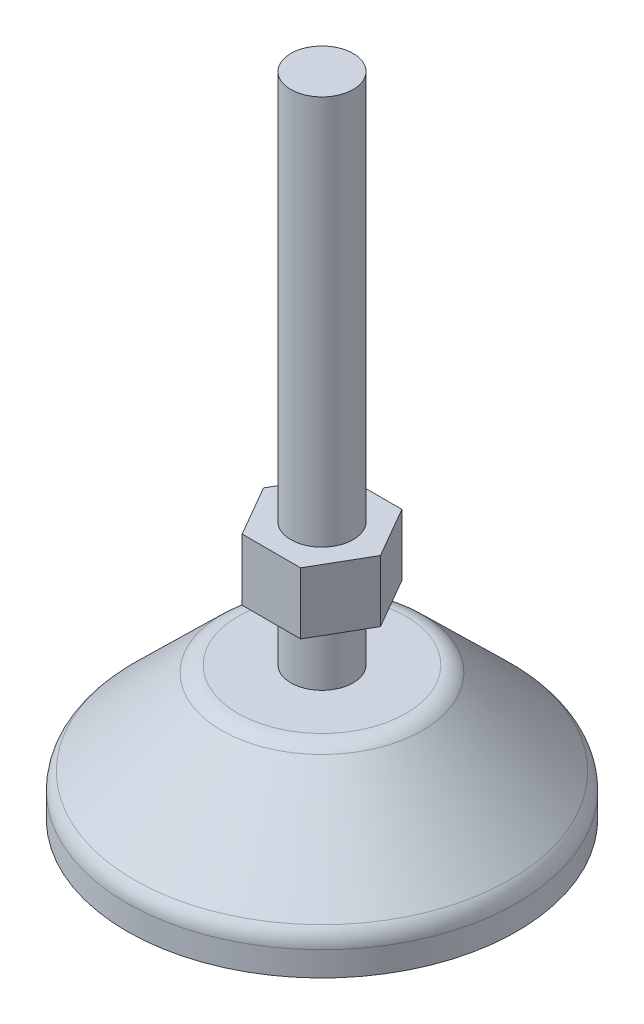
ISO-10303-21;
HEADER;
FILE_DESCRIPTION(('STEP AP214'),'2;1');
FILE_NAME('part.step','',(''),(''),'','','');
FILE_SCHEMA(('AUTOMOTIVE_DESIGN { 1 0 10303 214 1 1 1 1 }'));
ENDSEC;
DATA;
#1=APPLICATION_CONTEXT('core data for automotive mechanical design processes');
#2=APPLICATION_PROTOCOL_DEFINITION('international standard','automotive_design',2000,#1);
#3=PRODUCT_CONTEXT('',#1,'mechanical');
#4=PRODUCT('Part','Part','',(#3));
#5=PRODUCT_RELATED_PRODUCT_CATEGORY('part','',(#4));
#6=PRODUCT_DEFINITION_FORMATION('','',#4);
#7=PRODUCT_DEFINITION_CONTEXT('part definition',#1,'design');
#8=PRODUCT_DEFINITION('design','',#6,#7);
#9=PRODUCT_DEFINITION_SHAPE('','',#8);
#10=(LENGTH_UNIT() NAMED_UNIT(*) SI_UNIT(.MILLI.,.METRE.));
#11=(NAMED_UNIT(*) PLANE_ANGLE_UNIT() SI_UNIT($,.RADIAN.));
#12=(NAMED_UNIT(*) SI_UNIT($,.STERADIAN.) SOLID_ANGLE_UNIT());
#13=UNCERTAINTY_MEASURE_WITH_UNIT(LENGTH_MEASURE(1.E-05),#10,'distance_accuracy_value','');
#14=(GEOMETRIC_REPRESENTATION_CONTEXT(3) GLOBAL_UNCERTAINTY_ASSIGNED_CONTEXT((#13)) GLOBAL_UNIT_ASSIGNED_CONTEXT((#10,
#11,#12)) REPRESENTATION_CONTEXT('',''));
#15=CARTESIAN_POINT('',(0.,0.,0.));
#16=DIRECTION('',(0.,0.,1.));
#17=DIRECTION('',(1.,0.,0.));
#18=AXIS2_PLACEMENT_3D('',#15,#16,#17);
#19=CARTESIAN_POINT('',(4.,25.1,0.));
#20=DIRECTION('',(0.,1.,0.));
#21=DIRECTION('',(0.,0.,1.));
#22=AXIS2_PLACEMENT_3D('',#19,#20,#21);
#23=PLANE('',#22);
#24=CARTESIAN_POINT('',(0.,25.1,0.));
#25=DIRECTION('',(0.,1.,0.));
#26=DIRECTION('',(0.,0.,1.));
#27=AXIS2_PLACEMENT_3D('',#24,#25,#26);
#28=CIRCLE('',#27,4.);
#29=CARTESIAN_POINT('',(0.,25.1,4.));
#30=VERTEX_POINT('',#29);
#31=EDGE_CURVE('E143',#30,#30,#28,.T.);
#32=ORIENTED_EDGE('',*,*,#31,.T.);
#33=EDGE_LOOP('',(#32));
#34=FACE_BOUND('',#33,.T.);
#35=DIRECTION('',(0.499999999999995,0.,-0.866025403784442));
#36=VECTOR('',#35,1.);
#37=CARTESIAN_POINT('',(6.62500000000002,25.1,1.51554445662276));
#38=LINE('',#37,#36);
#39=CARTESIAN_POINT('',(3.75000000000008,25.1,6.49519052838325));
#40=VERTEX_POINT('',#39);
#41=CARTESIAN_POINT('',(7.5,25.1,0.));
#42=VERTEX_POINT('',#41);
#43=EDGE_CURVE('E135',#40,#42,#38,.T.);
#44=ORIENTED_EDGE('',*,*,#43,.F.);
#45=DIRECTION('',(1.,0.,0.));
#46=VECTOR('',#45,1.);
#47=CARTESIAN_POINT('',(4.00000000000007,25.1,6.49519052838324));
#48=LINE('',#47,#46);
#49=CARTESIAN_POINT('',(-3.74999999999994,25.1,6.49519052838332));
#50=VERTEX_POINT('',#49);
#51=EDGE_CURVE('E133',#50,#40,#48,.T.);
#52=ORIENTED_EDGE('',*,*,#51,.F.);
#53=DIRECTION('',(0.500000000000007,0.,0.866025403784435));
#54=VECTOR('',#53,1.);
#55=CARTESIAN_POINT('',(-4.62499999999994,25.1,4.97964607176058));
#56=LINE('',#55,#54);
#57=CARTESIAN_POINT('',(-7.5,25.1,0.));
#58=VERTEX_POINT('',#57);
#59=EDGE_CURVE('E131',#58,#50,#56,.T.);
#60=ORIENTED_EDGE('',*,*,#59,.F.);
#61=DIRECTION('',(-0.499999999999995,0.,0.866025403784442));
#62=VECTOR('',#61,1.);
#63=CARTESIAN_POINT('',(-4.62500000000003,25.1,-4.97964607176047));
#64=LINE('',#63,#62);
#65=CARTESIAN_POINT('',(-3.75000000000003,25.1,-6.49519052838327));
#66=VERTEX_POINT('',#65);
#67=EDGE_CURVE('E129',#66,#58,#64,.T.);
#68=ORIENTED_EDGE('',*,*,#67,.F.);
#69=DIRECTION('',(-1.,0.,0.));
#70=VECTOR('',#69,1.);
#71=CARTESIAN_POINT('',(3.99999999999998,25.1,-6.4951905283833));
#72=LINE('',#71,#70);
#73=CARTESIAN_POINT('',(3.74999999999998,25.1,-6.4951905283833));
#74=VERTEX_POINT('',#73);
#75=EDGE_CURVE('E91',#74,#66,#72,.T.);
#76=ORIENTED_EDGE('',*,*,#75,.F.);
#77=DIRECTION('',(-0.500000000000001,0.,-0.866025403784438));
#78=VECTOR('',#77,1.);
#79=CARTESIAN_POINT('',(6.625,25.1,-1.51554445662277));
#80=LINE('',#79,#78);
#81=EDGE_CURVE('E121',#42,#74,#80,.T.);
#82=ORIENTED_EDGE('',*,*,#81,.F.);
#83=EDGE_LOOP('',(#44,#52,#60,#68,#76,#82));
#84=FACE_BOUND('',#83,.T.);
#85=ADVANCED_FACE('F35',(#34,#84),#23,.F.);
#86=CARTESIAN_POINT('',(0.,0.,0.));
#87=DIRECTION('',(0.,1.,0.));
#88=DIRECTION('',(0.,0.,1.));
#89=AXIS2_PLACEMENT_3D('',#86,#87,#88);
#90=PLANE('',#89);
#91=CARTESIAN_POINT('',(0.,0.,0.));
#92=DIRECTION('',(0.,1.,0.));
#93=DIRECTION('',(0.,0.,1.));
#94=AXIS2_PLACEMENT_3D('',#91,#92,#93);
#95=CIRCLE('',#94,25.);
#96=CARTESIAN_POINT('',(0.,0.,25.));
#97=VERTEX_POINT('',#96);
#98=EDGE_CURVE('E11',#97,#97,#95,.T.);
#99=ORIENTED_EDGE('',*,*,#98,.F.);
#100=EDGE_LOOP('',(#99));
#101=FACE_BOUND('',#100,.T.);
#102=ADVANCED_FACE('F37',(#101),#90,.F.);
#103=CARTESIAN_POINT('',(0.,83.,0.));
#104=DIRECTION('',(0.,1.,0.));
#105=DIRECTION('',(0.,0.,1.));
#106=AXIS2_PLACEMENT_3D('',#103,#104,#105);
#107=CYLINDRICAL_SURFACE('',#106,25.);
#108=CARTESIAN_POINT('',(0.,3.13468674441344,0.));
#109=DIRECTION('',(0.,1.,0.));
#110=DIRECTION('',(0.,0.,1.));
#111=AXIS2_PLACEMENT_3D('',#108,#109,#110);
#112=CIRCLE('',#111,25.);
#113=CARTESIAN_POINT('',(0.,3.13468674441344,25.));
#114=VERTEX_POINT('',#113);
#115=EDGE_CURVE('E43',#114,#114,#112,.T.);
#116=ORIENTED_EDGE('',*,*,#115,.F.);
#117=EDGE_LOOP('',(#116));
#118=FACE_BOUND('',#117,.T.);
#119=ORIENTED_EDGE('',*,*,#98,.T.);
#120=EDGE_LOOP('',(#119));
#121=FACE_BOUND('',#120,.T.);
#122=ADVANCED_FACE('F162',(#118,#121),#107,.T.);
#123=CARTESIAN_POINT('',(0.,3.13468674441344,0.));
#124=DIRECTION('',(0.,1.,0.));
#125=DIRECTION('',(0.,0.,1.));
#126=AXIS2_PLACEMENT_3D('',#123,#124,#125);
#127=TOROIDAL_SURFACE('',#126,22.,3.);
#128=CARTESIAN_POINT('',(0.,5.28043631475277,0.));
#129=DIRECTION('',(0.,1.,0.));
#130=DIRECTION('',(0.,0.,1.));
#131=AXIS2_PLACEMENT_3D('',#128,#129,#130);
#132=CIRCLE('',#131,24.0966064917835);
#133=CARTESIAN_POINT('',(0.,5.28043631475277,24.0966064917835));
#134=VERTEX_POINT('',#133);
#135=EDGE_CURVE('E155',#134,#134,#132,.T.);
#136=ORIENTED_EDGE('',*,*,#135,.F.);
#137=EDGE_LOOP('',(#136));
#138=FACE_BOUND('',#137,.T.);
#139=ORIENTED_EDGE('',*,*,#115,.T.);
#140=EDGE_LOOP('',(#139));
#141=FACE_BOUND('',#140,.T.);
#142=ADVANCED_FACE('F160',(#138,#141),#127,.T.);
#143=CARTESIAN_POINT('',(0.,5.28043631475277,0.));
#144=DIRECTION('',(0.,-1.,0.));
#145=DIRECTION('',(0.,0.,-1.));
#146=AXIS2_PLACEMENT_3D('',#143,#144,#145);
#147=CONICAL_SURFACE('',#146,24.0966064917835,0.796981557127882);
#148=CARTESIAN_POINT('',(0.,16.2457495703396,0.));
#149=DIRECTION('',(0.,1.,0.));
#150=DIRECTION('',(0.,0.,1.));
#151=AXIS2_PLACEMENT_3D('',#148,#149,#150);
#152=CIRCLE('',#151,12.8742734984321);
#153=CARTESIAN_POINT('',(0.,16.2457495703396,12.8742734984321));
#154=VERTEX_POINT('',#153);
#155=EDGE_CURVE('E152',#154,#154,#152,.T.);
#156=ORIENTED_EDGE('',*,*,#155,.F.);
#157=EDGE_LOOP('',(#156));
#158=FACE_BOUND('',#157,.T.);
#159=ORIENTED_EDGE('',*,*,#135,.T.);
#160=EDGE_LOOP('',(#159));
#161=FACE_BOUND('',#160,.T.);
#162=ADVANCED_FACE('F191',(#158,#161),#147,.T.);
#163=CARTESIAN_POINT('',(0.,14.1,0.));
#164=DIRECTION('',(0.,1.,0.));
#165=DIRECTION('',(0.,0.,1.));
#166=AXIS2_PLACEMENT_3D('',#163,#164,#165);
#167=TOROIDAL_SURFACE('',#166,10.7776670066487,3.00000000000008);
#168=CARTESIAN_POINT('',(0.,17.1000000000001,0.));
#169=DIRECTION('',(0.,1.,0.));
#170=DIRECTION('',(0.,0.,1.));
#171=AXIS2_PLACEMENT_3D('',#168,#169,#170);
#172=CIRCLE('',#171,10.7776670066487);
#173=CARTESIAN_POINT('',(0.,17.1000000000001,10.7776670066487));
#174=VERTEX_POINT('',#173);
#175=EDGE_CURVE('E149',#174,#174,#172,.T.);
#176=ORIENTED_EDGE('',*,*,#175,.F.);
#177=EDGE_LOOP('',(#176));
#178=FACE_BOUND('',#177,.T.);
#179=ORIENTED_EDGE('',*,*,#155,.T.);
#180=EDGE_LOOP('',(#179));
#181=FACE_BOUND('',#180,.T.);
#182=ADVANCED_FACE('F187',(#178,#181),#167,.T.);
#183=CARTESIAN_POINT('',(10.7776670066487,17.1000000000001,0.));
#184=DIRECTION('',(0.,-1.,0.));
#185=DIRECTION('',(0.,0.,-1.));
#186=AXIS2_PLACEMENT_3D('',#183,#184,#185);
#187=PLANE('',#186);
#188=CARTESIAN_POINT('',(0.,17.1,0.));
#189=DIRECTION('',(0.,1.,0.));
#190=DIRECTION('',(0.,0.,1.));
#191=AXIS2_PLACEMENT_3D('',#188,#189,#190);
#192=CIRCLE('',#191,4.);
#193=CARTESIAN_POINT('',(0.,17.1,4.));
#194=VERTEX_POINT('',#193);
#195=EDGE_CURVE('E146',#194,#194,#192,.T.);
#196=ORIENTED_EDGE('',*,*,#195,.F.);
#197=EDGE_LOOP('',(#196));
#198=FACE_BOUND('',#197,.T.);
#199=ORIENTED_EDGE('',*,*,#175,.T.);
#200=EDGE_LOOP('',(#199));
#201=FACE_BOUND('',#200,.T.);
#202=ADVANCED_FACE('F183',(#198,#201),#187,.F.);
#203=CARTESIAN_POINT('',(0.,83.,0.));
#204=DIRECTION('',(0.,1.,0.));
#205=DIRECTION('',(0.,0.,1.));
#206=AXIS2_PLACEMENT_3D('',#203,#204,#205);
#207=CYLINDRICAL_SURFACE('',#206,4.);
#208=ORIENTED_EDGE('',*,*,#31,.F.);
#209=EDGE_LOOP('',(#208));
#210=FACE_BOUND('',#209,.T.);
#211=ORIENTED_EDGE('',*,*,#195,.T.);
#212=EDGE_LOOP('',(#211));
#213=FACE_BOUND('',#212,.T.);
#214=ADVANCED_FACE('F179',(#210,#213),#207,.T.);
#215=CARTESIAN_POINT('',(3.75000000000008,23.,6.49519052838325));
#216=DIRECTION('',(0.866025403784442,0.,0.499999999999995));
#217=DIRECTION('',(0.499999999999995,0.,-0.866025403784442));
#218=AXIS2_PLACEMENT_3D('',#215,#216,#217);
#219=PLANE('',#218);
#220=ORIENTED_EDGE('',*,*,#43,.T.);
#221=DIRECTION('',(0.,1.,0.));
#222=VECTOR('',#221,1.);
#223=CARTESIAN_POINT('',(7.5,23.,0.));
#224=LINE('',#223,#222);
#225=CARTESIAN_POINT('',(7.5,33.,0.));
#226=VERTEX_POINT('',#225);
#227=EDGE_CURVE('E50',#42,#226,#224,.T.);
#228=ORIENTED_EDGE('',*,*,#227,.T.);
#229=DIRECTION('',(0.499999999999995,0.,-0.866025403784441));
#230=VECTOR('',#229,1.);
#231=CARTESIAN_POINT('',(3.75000000000008,33.,6.49519052838325));
#232=LINE('',#231,#230);
#233=CARTESIAN_POINT('',(3.75000000000008,33.,6.49519052838325));
#234=VERTEX_POINT('',#233);
#235=EDGE_CURVE('E111',#234,#226,#232,.T.);
#236=ORIENTED_EDGE('',*,*,#235,.F.);
#237=DIRECTION('',(0.,1.,0.));
#238=VECTOR('',#237,1.);
#239=CARTESIAN_POINT('',(3.75000000000008,23.,6.49519052838325));
#240=LINE('',#239,#238);
#241=EDGE_CURVE('E119',#40,#234,#240,.T.);
#242=ORIENTED_EDGE('',*,*,#241,.F.);
#243=EDGE_LOOP('',(#220,#228,#236,#242));
#244=FACE_BOUND('',#243,.T.);
#245=ADVANCED_FACE('F182',(#244),#219,.T.);
#246=CARTESIAN_POINT('',(-3.74999999999994,23.,6.49519052838332));
#247=DIRECTION('',(0.,0.,1.));
#248=DIRECTION('',(1.,0.,0.));
#249=AXIS2_PLACEMENT_3D('',#246,#247,#248);
#250=PLANE('',#249);
#251=ORIENTED_EDGE('',*,*,#51,.T.);
#252=ORIENTED_EDGE('',*,*,#241,.T.);
#253=DIRECTION('',(1.,0.,0.));
#254=VECTOR('',#253,1.);
#255=CARTESIAN_POINT('',(-3.74999999999994,33.,6.49519052838332));
#256=LINE('',#255,#254);
#257=CARTESIAN_POINT('',(-3.74999999999994,33.,6.49519052838332));
#258=VERTEX_POINT('',#257);
#259=EDGE_CURVE('E116',#258,#234,#256,.T.);
#260=ORIENTED_EDGE('',*,*,#259,.F.);
#261=DIRECTION('',(0.,1.,0.));
#262=VECTOR('',#261,1.);
#263=CARTESIAN_POINT('',(-3.74999999999994,23.,6.49519052838332));
#264=LINE('',#263,#262);
#265=EDGE_CURVE('E122',#50,#258,#264,.T.);
#266=ORIENTED_EDGE('',*,*,#265,.F.);
#267=EDGE_LOOP('',(#251,#252,#260,#266));
#268=FACE_BOUND('',#267,.T.);
#269=ADVANCED_FACE('F227',(#268),#250,.T.);
#270=CARTESIAN_POINT('',(-7.5,23.,0.));
#271=DIRECTION('',(-0.866025403784434,0.,0.500000000000007));
#272=DIRECTION('',(0.500000000000007,0.,0.866025403784435));
#273=AXIS2_PLACEMENT_3D('',#270,#271,#272);
#274=PLANE('',#273);
#275=ORIENTED_EDGE('',*,*,#59,.T.);
#276=ORIENTED_EDGE('',*,*,#265,.T.);
#277=DIRECTION('',(0.500000000000007,0.,0.866025403784435));
#278=VECTOR('',#277,1.);
#279=CARTESIAN_POINT('',(-7.5,33.,0.));
#280=LINE('',#279,#278);
#281=CARTESIAN_POINT('',(-7.5,33.,0.));
#282=VERTEX_POINT('',#281);
#283=EDGE_CURVE('E104',#282,#258,#280,.T.);
#284=ORIENTED_EDGE('',*,*,#283,.F.);
#285=DIRECTION('',(0.,1.,0.));
#286=VECTOR('',#285,1.);
#287=CARTESIAN_POINT('',(-7.5,23.,0.));
#288=LINE('',#287,#286);
#289=EDGE_CURVE('E94',#58,#282,#288,.T.);
#290=ORIENTED_EDGE('',*,*,#289,.F.);
#291=EDGE_LOOP('',(#275,#276,#284,#290));
#292=FACE_BOUND('',#291,.T.);
#293=ADVANCED_FACE('F235',(#292),#274,.T.);
#294=CARTESIAN_POINT('',(-3.75000000000003,23.,-6.49519052838327));
#295=DIRECTION('',(-0.866025403784442,0.,-0.499999999999995));
#296=DIRECTION('',(-0.499999999999995,0.,0.866025403784442));
#297=AXIS2_PLACEMENT_3D('',#294,#295,#296);
#298=PLANE('',#297);
#299=ORIENTED_EDGE('',*,*,#67,.T.);
#300=ORIENTED_EDGE('',*,*,#289,.T.);
#301=DIRECTION('',(-0.499999999999995,0.,0.866025403784442));
#302=VECTOR('',#301,1.);
#303=CARTESIAN_POINT('',(-3.75000000000003,33.,-6.49519052838327));
#304=LINE('',#303,#302);
#305=CARTESIAN_POINT('',(-3.75000000000003,33.,-6.49519052838327));
#306=VERTEX_POINT('',#305);
#307=EDGE_CURVE('E98',#306,#282,#304,.T.);
#308=ORIENTED_EDGE('',*,*,#307,.F.);
#309=DIRECTION('',(0.,1.,0.));
#310=VECTOR('',#309,1.);
#311=CARTESIAN_POINT('',(-3.75000000000003,23.,-6.49519052838327));
#312=LINE('',#311,#310);
#313=EDGE_CURVE('E87',#66,#306,#312,.T.);
#314=ORIENTED_EDGE('',*,*,#313,.F.);
#315=EDGE_LOOP('',(#299,#300,#308,#314));
#316=FACE_BOUND('',#315,.T.);
#317=ADVANCED_FACE('F99',(#316),#298,.T.);
#318=CARTESIAN_POINT('',(3.74999999999998,23.,-6.4951905283833));
#319=DIRECTION('',(0.,0.,-1.));
#320=DIRECTION('',(-1.,0.,0.));
#321=AXIS2_PLACEMENT_3D('',#318,#319,#320);
#322=PLANE('',#321);
#323=ORIENTED_EDGE('',*,*,#75,.T.);
#324=ORIENTED_EDGE('',*,*,#313,.T.);
#325=DIRECTION('',(-1.,0.,0.));
#326=VECTOR('',#325,1.);
#327=CARTESIAN_POINT('',(3.74999999999998,33.,-6.4951905283833));
#328=LINE('',#327,#326);
#329=CARTESIAN_POINT('',(3.74999999999999,33.,-6.4951905283833));
#330=VERTEX_POINT('',#329);
#331=EDGE_CURVE('E58',#330,#306,#328,.T.);
#332=ORIENTED_EDGE('',*,*,#331,.F.);
#333=DIRECTION('',(0.,1.,0.));
#334=VECTOR('',#333,1.);
#335=CARTESIAN_POINT('',(3.74999999999998,23.,-6.4951905283833));
#336=LINE('',#335,#334);
#337=EDGE_CURVE('E95',#74,#330,#336,.T.);
#338=ORIENTED_EDGE('',*,*,#337,.F.);
#339=EDGE_LOOP('',(#323,#324,#332,#338));
#340=FACE_BOUND('',#339,.T.);
#341=ADVANCED_FACE('F89',(#340),#322,.T.);
#342=CARTESIAN_POINT('',(7.5,23.,0.));
#343=DIRECTION('',(0.866025403784438,0.,-0.500000000000001));
#344=DIRECTION('',(-0.500000000000001,0.,-0.866025403784438));
#345=AXIS2_PLACEMENT_3D('',#342,#343,#344);
#346=PLANE('',#345);
#347=ORIENTED_EDGE('',*,*,#81,.T.);
#348=ORIENTED_EDGE('',*,*,#337,.T.);
#349=DIRECTION('',(-0.500000000000001,0.,-0.866025403784438));
#350=VECTOR('',#349,1.);
#351=CARTESIAN_POINT('',(7.5,33.,0.));
#352=LINE('',#351,#350);
#353=EDGE_CURVE('E109',#226,#330,#352,.T.);
#354=ORIENTED_EDGE('',*,*,#353,.F.);
#355=ORIENTED_EDGE('',*,*,#227,.F.);
#356=EDGE_LOOP('',(#347,#348,#354,#355));
#357=FACE_BOUND('',#356,.T.);
#358=ADVANCED_FACE('F256',(#357),#346,.T.);
#359=CARTESIAN_POINT('',(4.,83.,0.));
#360=DIRECTION('',(0.,-1.,0.));
#361=DIRECTION('',(0.,0.,-1.));
#362=AXIS2_PLACEMENT_3D('',#359,#360,#361);
#363=PLANE('',#362);
#364=CARTESIAN_POINT('',(0.,83.,0.));
#365=DIRECTION('',(0.,1.,0.));
#366=DIRECTION('',(0.,0.,1.));
#367=AXIS2_PLACEMENT_3D('',#364,#365,#366);
#368=CIRCLE('',#367,4.);
#369=CARTESIAN_POINT('',(0.,83.,4.));
#370=VERTEX_POINT('',#369);
#371=EDGE_CURVE('E137',#370,#370,#368,.T.);
#372=ORIENTED_EDGE('',*,*,#371,.T.);
#373=EDGE_LOOP('',(#372));
#374=FACE_BOUND('',#373,.T.);
#375=ADVANCED_FACE('F263',(#374),#363,.F.);
#376=CARTESIAN_POINT('',(0.,83.,0.));
#377=DIRECTION('',(0.,1.,0.));
#378=DIRECTION('',(0.,0.,1.));
#379=AXIS2_PLACEMENT_3D('',#376,#377,#378);
#380=CYLINDRICAL_SURFACE('',#379,4.);
#381=ORIENTED_EDGE('',*,*,#371,.F.);
#382=EDGE_LOOP('',(#381));
#383=FACE_BOUND('',#382,.T.);
#384=CARTESIAN_POINT('',(0.,33.,0.));
#385=DIRECTION('',(0.,1.,0.));
#386=DIRECTION('',(0.,0.,1.));
#387=AXIS2_PLACEMENT_3D('',#384,#385,#386);
#388=CIRCLE('',#387,4.);
#389=CARTESIAN_POINT('',(0.,33.,4.));
#390=VERTEX_POINT('',#389);
#391=EDGE_CURVE('E140',#390,#390,#388,.T.);
#392=ORIENTED_EDGE('',*,*,#391,.T.);
#393=EDGE_LOOP('',(#392));
#394=FACE_BOUND('',#393,.T.);
#395=ADVANCED_FACE('F271',(#383,#394),#380,.T.);
#396=CARTESIAN_POINT('',(4.,33.,0.));
#397=DIRECTION('',(0.,-1.,0.));
#398=DIRECTION('',(0.,0.,-1.));
#399=AXIS2_PLACEMENT_3D('',#396,#397,#398);
#400=PLANE('',#399);
#401=ORIENTED_EDGE('',*,*,#391,.F.);
#402=EDGE_LOOP('',(#401));
#403=FACE_BOUND('',#402,.T.);
#404=ORIENTED_EDGE('',*,*,#235,.T.);
#405=ORIENTED_EDGE('',*,*,#353,.T.);
#406=ORIENTED_EDGE('',*,*,#331,.T.);
#407=ORIENTED_EDGE('',*,*,#307,.T.);
#408=ORIENTED_EDGE('',*,*,#283,.T.);
#409=ORIENTED_EDGE('',*,*,#259,.T.);
#410=EDGE_LOOP('',(#404,#405,#406,#407,#408,#409));
#411=FACE_BOUND('',#410,.T.);
#412=ADVANCED_FACE('F108',(#403,#411),#400,.F.);
#413=CLOSED_SHELL('',(#85,#102,#122,#142,#162,#182,#202,#214,#245,#269,#293,#317,#341,#358,#375,
#395,#412));
#414=MANIFOLD_SOLID_BREP('B2',#413);
#415=ADVANCED_BREP_SHAPE_REPRESENTATION('',(#18,#414),#14);
#416=SHAPE_DEFINITION_REPRESENTATION(#9,#415);
ENDSEC;
END-ISO-10303-21;
